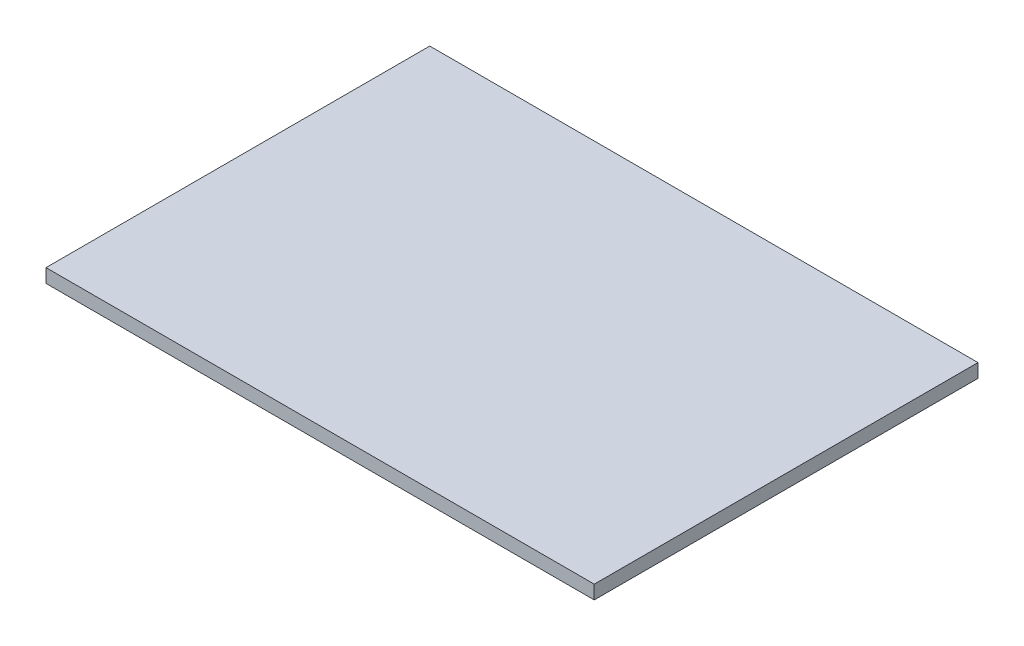
ISO-10303-21;
HEADER;
FILE_DESCRIPTION(('STEP AP214'),'2;1');
FILE_NAME('part.step','',(''),(''),'','','');
FILE_SCHEMA(('AUTOMOTIVE_DESIGN { 1 0 10303 214 1 1 1 1 }'));
ENDSEC;
DATA;
#1=APPLICATION_CONTEXT('core data for automotive mechanical design processes');
#2=APPLICATION_PROTOCOL_DEFINITION('international standard','automotive_design',2000,#1);
#3=PRODUCT_CONTEXT('',#1,'mechanical');
#4=PRODUCT('Part','Part','',(#3));
#5=PRODUCT_RELATED_PRODUCT_CATEGORY('part','',(#4));
#6=PRODUCT_DEFINITION_FORMATION('','',#4);
#7=PRODUCT_DEFINITION_CONTEXT('part definition',#1,'design');
#8=PRODUCT_DEFINITION('design','',#6,#7);
#9=PRODUCT_DEFINITION_SHAPE('','',#8);
#10=(LENGTH_UNIT() NAMED_UNIT(*) SI_UNIT(.MILLI.,.METRE.));
#11=(NAMED_UNIT(*) PLANE_ANGLE_UNIT() SI_UNIT($,.RADIAN.));
#12=(NAMED_UNIT(*) SI_UNIT($,.STERADIAN.) SOLID_ANGLE_UNIT());
#13=UNCERTAINTY_MEASURE_WITH_UNIT(LENGTH_MEASURE(1.E-05),#10,'distance_accuracy_value','');
#14=(GEOMETRIC_REPRESENTATION_CONTEXT(3) GLOBAL_UNCERTAINTY_ASSIGNED_CONTEXT((#13)) GLOBAL_UNIT_ASSIGNED_CONTEXT((#10,
#11,#12)) REPRESENTATION_CONTEXT('',''));
#15=CARTESIAN_POINT('',(0.,0.,0.));
#16=DIRECTION('',(0.,0.,1.));
#17=DIRECTION('',(1.,0.,0.));
#18=AXIS2_PLACEMENT_3D('',#15,#16,#17);
#19=CARTESIAN_POINT('',(0.,5.,0.));
#20=DIRECTION('',(1.,0.,0.));
#21=DIRECTION('',(0.,0.,-1.));
#22=AXIS2_PLACEMENT_3D('',#19,#20,#21);
#23=PLANE('',#22);
#24=DIRECTION('',(0.,0.,1.));
#25=VECTOR('',#24,1.);
#26=CARTESIAN_POINT('',(0.,0.,0.));
#27=LINE('',#26,#25);
#28=CARTESIAN_POINT('',(0.,0.,0.));
#29=VERTEX_POINT('',#28);
#30=CARTESIAN_POINT('',(0.,0.,140.));
#31=VERTEX_POINT('',#30);
#32=EDGE_CURVE('E100',#29,#31,#27,.T.);
#33=ORIENTED_EDGE('',*,*,#32,.T.);
#34=DIRECTION('',(0.,-1.,0.));
#35=VECTOR('',#34,1.);
#36=CARTESIAN_POINT('',(0.,5.,140.));
#37=LINE('',#36,#35);
#38=CARTESIAN_POINT('',(0.,5.,140.));
#39=VERTEX_POINT('',#38);
#40=EDGE_CURVE('E11',#39,#31,#37,.T.);
#41=ORIENTED_EDGE('',*,*,#40,.F.);
#42=DIRECTION('',(0.,0.,1.));
#43=VECTOR('',#42,1.);
#44=CARTESIAN_POINT('',(0.,5.,0.));
#45=LINE('',#44,#43);
#46=CARTESIAN_POINT('',(0.,5.,0.));
#47=VERTEX_POINT('',#46);
#48=EDGE_CURVE('E88',#47,#39,#45,.T.);
#49=ORIENTED_EDGE('',*,*,#48,.F.);
#50=DIRECTION('',(0.,-1.,0.));
#51=VECTOR('',#50,1.);
#52=CARTESIAN_POINT('',(0.,5.,0.));
#53=LINE('',#52,#51);
#54=EDGE_CURVE('E96',#47,#29,#53,.T.);
#55=ORIENTED_EDGE('',*,*,#54,.T.);
#56=EDGE_LOOP('',(#33,#41,#49,#55));
#57=FACE_BOUND('',#56,.T.);
#58=ADVANCED_FACE('F37',(#57),#23,.F.);
#59=CARTESIAN_POINT('',(0.,5.,140.));
#60=DIRECTION('',(0.,0.,-1.));
#61=DIRECTION('',(-1.,0.,0.));
#62=AXIS2_PLACEMENT_3D('',#59,#60,#61);
#63=PLANE('',#62);
#64=DIRECTION('',(1.,0.,0.));
#65=VECTOR('',#64,1.);
#66=CARTESIAN_POINT('',(0.,0.,140.));
#67=LINE('',#66,#65);
#68=CARTESIAN_POINT('',(200.,0.,140.));
#69=VERTEX_POINT('',#68);
#70=EDGE_CURVE('E92',#31,#69,#67,.T.);
#71=ORIENTED_EDGE('',*,*,#70,.T.);
#72=DIRECTION('',(0.,-1.,0.));
#73=VECTOR('',#72,1.);
#74=CARTESIAN_POINT('',(200.,5.,140.));
#75=LINE('',#74,#73);
#76=CARTESIAN_POINT('',(200.,5.,140.));
#77=VERTEX_POINT('',#76);
#78=EDGE_CURVE('E45',#77,#69,#75,.T.);
#79=ORIENTED_EDGE('',*,*,#78,.F.);
#80=DIRECTION('',(1.,0.,0.));
#81=VECTOR('',#80,1.);
#82=CARTESIAN_POINT('',(0.,5.,140.));
#83=LINE('',#82,#81);
#84=EDGE_CURVE('E83',#39,#77,#83,.T.);
#85=ORIENTED_EDGE('',*,*,#84,.F.);
#86=ORIENTED_EDGE('',*,*,#40,.T.);
#87=EDGE_LOOP('',(#71,#79,#85,#86));
#88=FACE_BOUND('',#87,.T.);
#89=ADVANCED_FACE('F91',(#88),#63,.F.);
#90=CARTESIAN_POINT('',(200.,5.,0.));
#91=DIRECTION('',(-1.,0.,0.));
#92=DIRECTION('',(0.,0.,1.));
#93=AXIS2_PLACEMENT_3D('',#90,#91,#92);
#94=PLANE('',#93);
#95=DIRECTION('',(0.,0.,-1.));
#96=VECTOR('',#95,1.);
#97=CARTESIAN_POINT('',(200.,0.,0.));
#98=LINE('',#97,#96);
#99=CARTESIAN_POINT('',(200.,0.,0.));
#100=VERTEX_POINT('',#99);
#101=EDGE_CURVE('E70',#69,#100,#98,.T.);
#102=ORIENTED_EDGE('',*,*,#101,.T.);
#103=DIRECTION('',(0.,-1.,0.));
#104=VECTOR('',#103,1.);
#105=CARTESIAN_POINT('',(200.,5.,0.));
#106=LINE('',#105,#104);
#107=CARTESIAN_POINT('',(200.,5.,0.));
#108=VERTEX_POINT('',#107);
#109=EDGE_CURVE('E93',#108,#100,#106,.T.);
#110=ORIENTED_EDGE('',*,*,#109,.F.);
#111=DIRECTION('',(0.,0.,-1.));
#112=VECTOR('',#111,1.);
#113=CARTESIAN_POINT('',(200.,5.,0.));
#114=LINE('',#113,#112);
#115=EDGE_CURVE('E86',#77,#108,#114,.T.);
#116=ORIENTED_EDGE('',*,*,#115,.F.);
#117=ORIENTED_EDGE('',*,*,#78,.T.);
#118=EDGE_LOOP('',(#102,#110,#116,#117));
#119=FACE_BOUND('',#118,.T.);
#120=ADVANCED_FACE('F94',(#119),#94,.F.);
#121=CARTESIAN_POINT('',(0.,5.,0.));
#122=DIRECTION('',(0.,0.,1.));
#123=DIRECTION('',(1.,0.,0.));
#124=AXIS2_PLACEMENT_3D('',#121,#122,#123);
#125=PLANE('',#124);
#126=DIRECTION('',(-1.,0.,0.));
#127=VECTOR('',#126,1.);
#128=CARTESIAN_POINT('',(0.,0.,0.));
#129=LINE('',#128,#127);
#130=EDGE_CURVE('E76',#100,#29,#129,.T.);
#131=ORIENTED_EDGE('',*,*,#130,.T.);
#132=ORIENTED_EDGE('',*,*,#54,.F.);
#133=DIRECTION('',(-1.,0.,0.));
#134=VECTOR('',#133,1.);
#135=CARTESIAN_POINT('',(0.,5.,0.));
#136=LINE('',#135,#134);
#137=EDGE_CURVE('E53',#108,#47,#136,.T.);
#138=ORIENTED_EDGE('',*,*,#137,.F.);
#139=ORIENTED_EDGE('',*,*,#109,.T.);
#140=EDGE_LOOP('',(#131,#132,#138,#139));
#141=FACE_BOUND('',#140,.T.);
#142=ADVANCED_FACE('F107',(#141),#125,.F.);
#143=CARTESIAN_POINT('',(0.,5.,0.));
#144=DIRECTION('',(0.,1.,0.));
#145=DIRECTION('',(0.,0.,1.));
#146=AXIS2_PLACEMENT_3D('',#143,#144,#145);
#147=PLANE('',#146);
#148=ORIENTED_EDGE('',*,*,#48,.T.);
#149=ORIENTED_EDGE('',*,*,#84,.T.);
#150=ORIENTED_EDGE('',*,*,#115,.T.);
#151=ORIENTED_EDGE('',*,*,#137,.T.);
#152=EDGE_LOOP('',(#148,#149,#150,#151));
#153=FACE_BOUND('',#152,.T.);
#154=ADVANCED_FACE('F84',(#153),#147,.T.);
#155=CARTESIAN_POINT('',(0.,0.,0.));
#156=DIRECTION('',(0.,1.,0.));
#157=DIRECTION('',(0.,0.,1.));
#158=AXIS2_PLACEMENT_3D('',#155,#156,#157);
#159=PLANE('',#158);
#160=ORIENTED_EDGE('',*,*,#32,.F.);
#161=ORIENTED_EDGE('',*,*,#130,.F.);
#162=ORIENTED_EDGE('',*,*,#101,.F.);
#163=ORIENTED_EDGE('',*,*,#70,.F.);
#164=EDGE_LOOP('',(#160,#161,#162,#163));
#165=FACE_BOUND('',#164,.T.);
#166=ADVANCED_FACE('F110',(#165),#159,.F.);
#167=CLOSED_SHELL('',(#58,#89,#120,#142,#154,#166));
#168=MANIFOLD_SOLID_BREP('B2',#167);
#169=ADVANCED_BREP_SHAPE_REPRESENTATION('',(#18,#168),#14);
#170=SHAPE_DEFINITION_REPRESENTATION(#9,#169);
ENDSEC;
END-ISO-10303-21;
